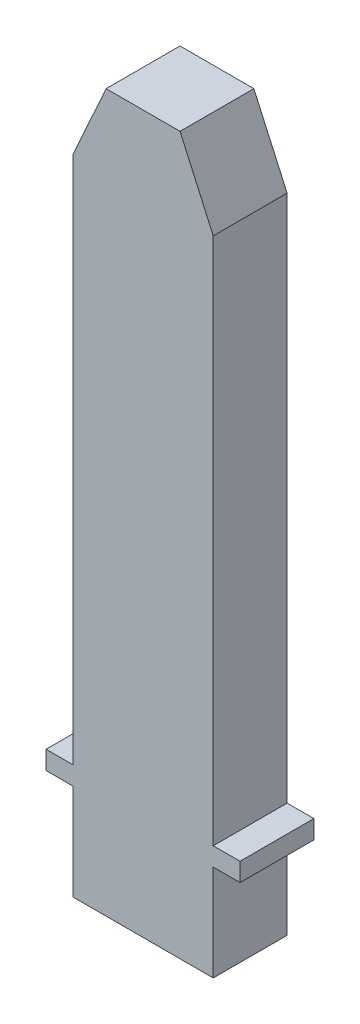
ISO-10303-21;
HEADER;
FILE_DESCRIPTION(('STEP AP214'),'2;1');
FILE_NAME('part.step','',(''),(''),'','','');
FILE_SCHEMA(('AUTOMOTIVE_DESIGN { 1 0 10303 214 1 1 1 1 }'));
ENDSEC;
DATA;
#1=APPLICATION_CONTEXT('core data for automotive mechanical design processes');
#2=APPLICATION_PROTOCOL_DEFINITION('international standard','automotive_design',2000,#1);
#3=PRODUCT_CONTEXT('',#1,'mechanical');
#4=PRODUCT('Part','Part','',(#3));
#5=PRODUCT_RELATED_PRODUCT_CATEGORY('part','',(#4));
#6=PRODUCT_DEFINITION_FORMATION('','',#4);
#7=PRODUCT_DEFINITION_CONTEXT('part definition',#1,'design');
#8=PRODUCT_DEFINITION('design','',#6,#7);
#9=PRODUCT_DEFINITION_SHAPE('','',#8);
#10=(LENGTH_UNIT() NAMED_UNIT(*) SI_UNIT(.MILLI.,.METRE.));
#11=(NAMED_UNIT(*) PLANE_ANGLE_UNIT() SI_UNIT($,.RADIAN.));
#12=(NAMED_UNIT(*) SI_UNIT($,.STERADIAN.) SOLID_ANGLE_UNIT());
#13=UNCERTAINTY_MEASURE_WITH_UNIT(LENGTH_MEASURE(1.E-05),#10,'distance_accuracy_value','');
#14=(GEOMETRIC_REPRESENTATION_CONTEXT(3) GLOBAL_UNCERTAINTY_ASSIGNED_CONTEXT((#13)) GLOBAL_UNIT_ASSIGNED_CONTEXT((#10,
#11,#12)) REPRESENTATION_CONTEXT('',''));
#15=CARTESIAN_POINT('',(0.,0.,0.));
#16=DIRECTION('',(0.,0.,1.));
#17=DIRECTION('',(1.,0.,0.));
#18=AXIS2_PLACEMENT_3D('',#15,#16,#17);
#19=CARTESIAN_POINT('',(-1.9,14.3,2.));
#20=DIRECTION('',(0.911921505175107,-0.410364677328798,0.));
#21=DIRECTION('',(0.410364677328798,0.911921505175107,0.));
#22=AXIS2_PLACEMENT_3D('',#19,#20,#21);
#23=PLANE('',#22);
#24=DIRECTION('',(-0.410364677328797,-0.911921505175106,0.));
#25=VECTOR('',#24,1.);
#26=CARTESIAN_POINT('',(-1.9,14.3,0.));
#27=LINE('',#26,#25);
#28=CARTESIAN_POINT('',(-1.,16.3,0.));
#29=VERTEX_POINT('',#28);
#30=CARTESIAN_POINT('',(-1.9,14.3,0.));
#31=VERTEX_POINT('',#30);
#32=EDGE_CURVE('E164',#29,#31,#27,.T.);
#33=ORIENTED_EDGE('',*,*,#32,.T.);
#34=DIRECTION('',(0.,0.,-1.));
#35=VECTOR('',#34,1.);
#36=CARTESIAN_POINT('',(-1.9,14.3,2.));
#37=LINE('',#36,#35);
#38=CARTESIAN_POINT('',(-1.9,14.3,2.));
#39=VERTEX_POINT('',#38);
#40=EDGE_CURVE('E11',#39,#31,#37,.T.);
#41=ORIENTED_EDGE('',*,*,#40,.F.);
#42=DIRECTION('',(-0.410364677328797,-0.911921505175106,0.));
#43=VECTOR('',#42,1.);
#44=CARTESIAN_POINT('',(-1.9,14.3,2.));
#45=LINE('',#44,#43);
#46=CARTESIAN_POINT('',(-1.,16.3,2.));
#47=VERTEX_POINT('',#46);
#48=EDGE_CURVE('E190',#47,#39,#45,.T.);
#49=ORIENTED_EDGE('',*,*,#48,.F.);
#50=DIRECTION('',(0.,0.,-1.));
#51=VECTOR('',#50,1.);
#52=CARTESIAN_POINT('',(-1.,16.3,2.));
#53=LINE('',#52,#51);
#54=EDGE_CURVE('E160',#47,#29,#53,.T.);
#55=ORIENTED_EDGE('',*,*,#54,.T.);
#56=EDGE_LOOP('',(#33,#41,#49,#55));
#57=FACE_BOUND('',#56,.T.);
#58=ADVANCED_FACE('F32',(#57),#23,.F.);
#59=CARTESIAN_POINT('',(-1.9,14.3,2.));
#60=DIRECTION('',(1.,0.,0.));
#61=DIRECTION('',(0.,1.,0.));
#62=AXIS2_PLACEMENT_3D('',#59,#60,#61);
#63=PLANE('',#62);
#64=DIRECTION('',(0.,-1.,0.));
#65=VECTOR('',#64,1.);
#66=CARTESIAN_POINT('',(-1.9,14.3,0.));
#67=LINE('',#66,#65);
#68=CARTESIAN_POINT('',(-1.9,0.,0.));
#69=VERTEX_POINT('',#68);
#70=EDGE_CURVE('E167',#31,#69,#67,.T.);
#71=ORIENTED_EDGE('',*,*,#70,.T.);
#72=DIRECTION('',(0.,0.,-1.));
#73=VECTOR('',#72,1.);
#74=CARTESIAN_POINT('',(-1.9,0.,2.));
#75=LINE('',#74,#73);
#76=CARTESIAN_POINT('',(-1.9,0.,2.));
#77=VERTEX_POINT('',#76);
#78=EDGE_CURVE('E40',#77,#69,#75,.T.);
#79=ORIENTED_EDGE('',*,*,#78,.F.);
#80=DIRECTION('',(0.,-1.,0.));
#81=VECTOR('',#80,1.);
#82=CARTESIAN_POINT('',(-1.9,14.3,2.));
#83=LINE('',#82,#81);
#84=EDGE_CURVE('E109',#39,#77,#83,.T.);
#85=ORIENTED_EDGE('',*,*,#84,.F.);
#86=ORIENTED_EDGE('',*,*,#40,.T.);
#87=EDGE_LOOP('',(#71,#79,#85,#86));
#88=FACE_BOUND('',#87,.T.);
#89=ADVANCED_FACE('F278',(#88),#63,.F.);
#90=CARTESIAN_POINT('',(-2.625,0.,2.));
#91=DIRECTION('',(0.,-1.,0.));
#92=DIRECTION('',(1.,0.,0.));
#93=AXIS2_PLACEMENT_3D('',#90,#91,#92);
#94=PLANE('',#93);
#95=DIRECTION('',(-1.,0.,0.));
#96=VECTOR('',#95,1.);
#97=CARTESIAN_POINT('',(-2.625,0.,0.));
#98=LINE('',#97,#96);
#99=CARTESIAN_POINT('',(-2.625,0.,0.));
#100=VERTEX_POINT('',#99);
#101=EDGE_CURVE('E169',#69,#100,#98,.T.);
#102=ORIENTED_EDGE('',*,*,#101,.T.);
#103=DIRECTION('',(0.,0.,-1.));
#104=VECTOR('',#103,1.);
#105=CARTESIAN_POINT('',(-2.625,0.,2.));
#106=LINE('',#105,#104);
#107=CARTESIAN_POINT('',(-2.625,0.,2.));
#108=VERTEX_POINT('',#107);
#109=EDGE_CURVE('E215',#108,#100,#106,.T.);
#110=ORIENTED_EDGE('',*,*,#109,.F.);
#111=DIRECTION('',(-1.,0.,0.));
#112=VECTOR('',#111,1.);
#113=CARTESIAN_POINT('',(-2.625,0.,2.));
#114=LINE('',#113,#112);
#115=EDGE_CURVE('E223',#77,#108,#114,.T.);
#116=ORIENTED_EDGE('',*,*,#115,.F.);
#117=ORIENTED_EDGE('',*,*,#78,.T.);
#118=EDGE_LOOP('',(#102,#110,#116,#117));
#119=FACE_BOUND('',#118,.T.);
#120=ADVANCED_FACE('F221',(#119),#94,.F.);
#121=CARTESIAN_POINT('',(-2.625,0.,2.));
#122=DIRECTION('',(1.,0.,0.));
#123=DIRECTION('',(0.,0.,-1.));
#124=AXIS2_PLACEMENT_3D('',#121,#122,#123);
#125=PLANE('',#124);
#126=DIRECTION('',(0.,-1.,0.));
#127=VECTOR('',#126,1.);
#128=CARTESIAN_POINT('',(-2.625,0.,0.));
#129=LINE('',#128,#127);
#130=CARTESIAN_POINT('',(-2.625,-0.5,0.));
#131=VERTEX_POINT('',#130);
#132=EDGE_CURVE('E171',#100,#131,#129,.T.);
#133=ORIENTED_EDGE('',*,*,#132,.T.);
#134=DIRECTION('',(0.,0.,-1.));
#135=VECTOR('',#134,1.);
#136=CARTESIAN_POINT('',(-2.625,-0.5,2.));
#137=LINE('',#136,#135);
#138=CARTESIAN_POINT('',(-2.625,-0.5,2.));
#139=VERTEX_POINT('',#138);
#140=EDGE_CURVE('E212',#139,#131,#137,.T.);
#141=ORIENTED_EDGE('',*,*,#140,.F.);
#142=DIRECTION('',(0.,-1.,0.));
#143=VECTOR('',#142,1.);
#144=CARTESIAN_POINT('',(-2.625,0.,2.));
#145=LINE('',#144,#143);
#146=EDGE_CURVE('E241',#108,#139,#145,.T.);
#147=ORIENTED_EDGE('',*,*,#146,.F.);
#148=ORIENTED_EDGE('',*,*,#109,.T.);
#149=EDGE_LOOP('',(#133,#141,#147,#148));
#150=FACE_BOUND('',#149,.T.);
#151=ADVANCED_FACE('F232',(#150),#125,.F.);
#152=CARTESIAN_POINT('',(-2.625,-0.5,2.));
#153=DIRECTION('',(0.,1.,0.));
#154=DIRECTION('',(0.,0.,1.));
#155=AXIS2_PLACEMENT_3D('',#152,#153,#154);
#156=PLANE('',#155);
#157=DIRECTION('',(1.,0.,0.));
#158=VECTOR('',#157,1.);
#159=CARTESIAN_POINT('',(-2.625,-0.5,0.));
#160=LINE('',#159,#158);
#161=CARTESIAN_POINT('',(-1.9,-0.5,0.));
#162=VERTEX_POINT('',#161);
#163=EDGE_CURVE('E173',#131,#162,#160,.T.);
#164=ORIENTED_EDGE('',*,*,#163,.T.);
#165=DIRECTION('',(0.,0.,-1.));
#166=VECTOR('',#165,1.);
#167=CARTESIAN_POINT('',(-1.9,-0.5,2.));
#168=LINE('',#167,#166);
#169=CARTESIAN_POINT('',(-1.9,-0.5,2.));
#170=VERTEX_POINT('',#169);
#171=EDGE_CURVE('E209',#170,#162,#168,.T.);
#172=ORIENTED_EDGE('',*,*,#171,.F.);
#173=DIRECTION('',(1.,0.,0.));
#174=VECTOR('',#173,1.);
#175=CARTESIAN_POINT('',(-2.625,-0.5,2.));
#176=LINE('',#175,#174);
#177=EDGE_CURVE('E238',#139,#170,#176,.T.);
#178=ORIENTED_EDGE('',*,*,#177,.F.);
#179=ORIENTED_EDGE('',*,*,#140,.T.);
#180=EDGE_LOOP('',(#164,#172,#178,#179));
#181=FACE_BOUND('',#180,.T.);
#182=ADVANCED_FACE('F236',(#181),#156,.F.);
#183=CARTESIAN_POINT('',(-1.9,-0.5,2.));
#184=DIRECTION('',(1.,0.,0.));
#185=DIRECTION('',(0.,1.,0.));
#186=AXIS2_PLACEMENT_3D('',#183,#184,#185);
#187=PLANE('',#186);
#188=DIRECTION('',(0.,-1.,0.));
#189=VECTOR('',#188,1.);
#190=CARTESIAN_POINT('',(-1.9,-0.5,0.));
#191=LINE('',#190,#189);
#192=CARTESIAN_POINT('',(-1.9,-3.1,0.));
#193=VERTEX_POINT('',#192);
#194=EDGE_CURVE('E175',#162,#193,#191,.T.);
#195=ORIENTED_EDGE('',*,*,#194,.T.);
#196=DIRECTION('',(0.,0.,-1.));
#197=VECTOR('',#196,1.);
#198=CARTESIAN_POINT('',(-1.9,-3.1,2.));
#199=LINE('',#198,#197);
#200=CARTESIAN_POINT('',(-1.9,-3.1,2.));
#201=VERTEX_POINT('',#200);
#202=EDGE_CURVE('E206',#201,#193,#199,.T.);
#203=ORIENTED_EDGE('',*,*,#202,.F.);
#204=DIRECTION('',(0.,-1.,0.));
#205=VECTOR('',#204,1.);
#206=CARTESIAN_POINT('',(-1.9,-0.5,2.));
#207=LINE('',#206,#205);
#208=EDGE_CURVE('E240',#170,#201,#207,.T.);
#209=ORIENTED_EDGE('',*,*,#208,.F.);
#210=ORIENTED_EDGE('',*,*,#171,.T.);
#211=EDGE_LOOP('',(#195,#203,#209,#210));
#212=FACE_BOUND('',#211,.T.);
#213=ADVANCED_FACE('F291',(#212),#187,.F.);
#214=CARTESIAN_POINT('',(-1.9,-3.1,2.));
#215=DIRECTION('',(0.,1.,0.));
#216=DIRECTION('',(0.,0.,1.));
#217=AXIS2_PLACEMENT_3D('',#214,#215,#216);
#218=PLANE('',#217);
#219=DIRECTION('',(1.,0.,0.));
#220=VECTOR('',#219,1.);
#221=CARTESIAN_POINT('',(-1.9,-3.1,0.));
#222=LINE('',#221,#220);
#223=CARTESIAN_POINT('',(1.9,-3.1,0.));
#224=VERTEX_POINT('',#223);
#225=EDGE_CURVE('E177',#193,#224,#222,.T.);
#226=ORIENTED_EDGE('',*,*,#225,.T.);
#227=DIRECTION('',(0.,0.,-1.));
#228=VECTOR('',#227,1.);
#229=CARTESIAN_POINT('',(1.9,-3.1,2.));
#230=LINE('',#229,#228);
#231=CARTESIAN_POINT('',(1.9,-3.1,2.));
#232=VERTEX_POINT('',#231);
#233=EDGE_CURVE('E203',#232,#224,#230,.T.);
#234=ORIENTED_EDGE('',*,*,#233,.F.);
#235=DIRECTION('',(1.,0.,0.));
#236=VECTOR('',#235,1.);
#237=CARTESIAN_POINT('',(-1.9,-3.1,2.));
#238=LINE('',#237,#236);
#239=EDGE_CURVE('E243',#201,#232,#238,.T.);
#240=ORIENTED_EDGE('',*,*,#239,.F.);
#241=ORIENTED_EDGE('',*,*,#202,.T.);
#242=EDGE_LOOP('',(#226,#234,#240,#241));
#243=FACE_BOUND('',#242,.T.);
#244=ADVANCED_FACE('F294',(#243),#218,.F.);
#245=CARTESIAN_POINT('',(1.9,-0.5,2.));
#246=DIRECTION('',(-1.,0.,0.));
#247=DIRECTION('',(0.,-1.,0.));
#248=AXIS2_PLACEMENT_3D('',#245,#246,#247);
#249=PLANE('',#248);
#250=DIRECTION('',(0.,1.,0.));
#251=VECTOR('',#250,1.);
#252=CARTESIAN_POINT('',(1.9,-0.5,0.));
#253=LINE('',#252,#251);
#254=CARTESIAN_POINT('',(1.9,-0.5,0.));
#255=VERTEX_POINT('',#254);
#256=EDGE_CURVE('E179',#224,#255,#253,.T.);
#257=ORIENTED_EDGE('',*,*,#256,.T.);
#258=DIRECTION('',(0.,0.,-1.));
#259=VECTOR('',#258,1.);
#260=CARTESIAN_POINT('',(1.9,-0.5,2.));
#261=LINE('',#260,#259);
#262=CARTESIAN_POINT('',(1.9,-0.5,2.));
#263=VERTEX_POINT('',#262);
#264=EDGE_CURVE('E200',#263,#255,#261,.T.);
#265=ORIENTED_EDGE('',*,*,#264,.F.);
#266=DIRECTION('',(0.,1.,0.));
#267=VECTOR('',#266,1.);
#268=CARTESIAN_POINT('',(1.9,-0.5,2.));
#269=LINE('',#268,#267);
#270=EDGE_CURVE('E249',#232,#263,#269,.T.);
#271=ORIENTED_EDGE('',*,*,#270,.F.);
#272=ORIENTED_EDGE('',*,*,#233,.T.);
#273=EDGE_LOOP('',(#257,#265,#271,#272));
#274=FACE_BOUND('',#273,.T.);
#275=ADVANCED_FACE('F298',(#274),#249,.F.);
#276=CARTESIAN_POINT('',(1.9,-0.5,2.));
#277=DIRECTION('',(0.,1.,0.));
#278=DIRECTION('',(0.,0.,1.));
#279=AXIS2_PLACEMENT_3D('',#276,#277,#278);
#280=PLANE('',#279);
#281=DIRECTION('',(1.,0.,0.));
#282=VECTOR('',#281,1.);
#283=CARTESIAN_POINT('',(1.9,-0.5,0.));
#284=LINE('',#283,#282);
#285=CARTESIAN_POINT('',(2.625,-0.5,0.));
#286=VERTEX_POINT('',#285);
#287=EDGE_CURVE('E181',#255,#286,#284,.T.);
#288=ORIENTED_EDGE('',*,*,#287,.T.);
#289=DIRECTION('',(0.,0.,-1.));
#290=VECTOR('',#289,1.);
#291=CARTESIAN_POINT('',(2.625,-0.5,2.));
#292=LINE('',#291,#290);
#293=CARTESIAN_POINT('',(2.625,-0.5,2.));
#294=VERTEX_POINT('',#293);
#295=EDGE_CURVE('E197',#294,#286,#292,.T.);
#296=ORIENTED_EDGE('',*,*,#295,.F.);
#297=DIRECTION('',(1.,0.,0.));
#298=VECTOR('',#297,1.);
#299=CARTESIAN_POINT('',(1.9,-0.5,2.));
#300=LINE('',#299,#298);
#301=EDGE_CURVE('E251',#263,#294,#300,.T.);
#302=ORIENTED_EDGE('',*,*,#301,.F.);
#303=ORIENTED_EDGE('',*,*,#264,.T.);
#304=EDGE_LOOP('',(#288,#296,#302,#303));
#305=FACE_BOUND('',#304,.T.);
#306=ADVANCED_FACE('F302',(#305),#280,.F.);
#307=CARTESIAN_POINT('',(2.625,0.,2.));
#308=DIRECTION('',(-1.,0.,0.));
#309=DIRECTION('',(0.,0.,1.));
#310=AXIS2_PLACEMENT_3D('',#307,#308,#309);
#311=PLANE('',#310);
#312=DIRECTION('',(0.,1.,0.));
#313=VECTOR('',#312,1.);
#314=CARTESIAN_POINT('',(2.625,0.,0.));
#315=LINE('',#314,#313);
#316=CARTESIAN_POINT('',(2.625,0.,0.));
#317=VERTEX_POINT('',#316);
#318=EDGE_CURVE('E183',#286,#317,#315,.T.);
#319=ORIENTED_EDGE('',*,*,#318,.T.);
#320=DIRECTION('',(0.,0.,-1.));
#321=VECTOR('',#320,1.);
#322=CARTESIAN_POINT('',(2.625,0.,2.));
#323=LINE('',#322,#321);
#324=CARTESIAN_POINT('',(2.625,0.,2.));
#325=VERTEX_POINT('',#324);
#326=EDGE_CURVE('E194',#325,#317,#323,.T.);
#327=ORIENTED_EDGE('',*,*,#326,.F.);
#328=DIRECTION('',(0.,1.,0.));
#329=VECTOR('',#328,1.);
#330=CARTESIAN_POINT('',(2.625,0.,2.));
#331=LINE('',#330,#329);
#332=EDGE_CURVE('E253',#294,#325,#331,.T.);
#333=ORIENTED_EDGE('',*,*,#332,.F.);
#334=ORIENTED_EDGE('',*,*,#295,.T.);
#335=EDGE_LOOP('',(#319,#327,#333,#334));
#336=FACE_BOUND('',#335,.T.);
#337=ADVANCED_FACE('F259',(#336),#311,.F.);
#338=CARTESIAN_POINT('',(1.9,0.,2.));
#339=DIRECTION('',(0.,-1.,0.));
#340=DIRECTION('',(1.,0.,0.));
#341=AXIS2_PLACEMENT_3D('',#338,#339,#340);
#342=PLANE('',#341);
#343=DIRECTION('',(-1.,0.,0.));
#344=VECTOR('',#343,1.);
#345=CARTESIAN_POINT('',(1.9,0.,0.));
#346=LINE('',#345,#344);
#347=CARTESIAN_POINT('',(1.9,0.,0.));
#348=VERTEX_POINT('',#347);
#349=EDGE_CURVE('E185',#317,#348,#346,.T.);
#350=ORIENTED_EDGE('',*,*,#349,.T.);
#351=DIRECTION('',(0.,0.,-1.));
#352=VECTOR('',#351,1.);
#353=CARTESIAN_POINT('',(1.9,0.,2.));
#354=LINE('',#353,#352);
#355=CARTESIAN_POINT('',(1.9,0.,2.));
#356=VERTEX_POINT('',#355);
#357=EDGE_CURVE('E155',#356,#348,#354,.T.);
#358=ORIENTED_EDGE('',*,*,#357,.F.);
#359=DIRECTION('',(-1.,0.,0.));
#360=VECTOR('',#359,1.);
#361=CARTESIAN_POINT('',(1.9,0.,2.));
#362=LINE('',#361,#360);
#363=EDGE_CURVE('E146',#325,#356,#362,.T.);
#364=ORIENTED_EDGE('',*,*,#363,.F.);
#365=ORIENTED_EDGE('',*,*,#326,.T.);
#366=EDGE_LOOP('',(#350,#358,#364,#365));
#367=FACE_BOUND('',#366,.T.);
#368=ADVANCED_FACE('F263',(#367),#342,.F.);
#369=CARTESIAN_POINT('',(1.9,14.3,2.));
#370=DIRECTION('',(-1.,0.,0.));
#371=DIRECTION('',(0.,-1.,0.));
#372=AXIS2_PLACEMENT_3D('',#369,#370,#371);
#373=PLANE('',#372);
#374=DIRECTION('',(0.,1.,0.));
#375=VECTOR('',#374,1.);
#376=CARTESIAN_POINT('',(1.9,14.3,0.));
#377=LINE('',#376,#375);
#378=CARTESIAN_POINT('',(1.9,14.3,0.));
#379=VERTEX_POINT('',#378);
#380=EDGE_CURVE('E154',#348,#379,#377,.T.);
#381=ORIENTED_EDGE('',*,*,#380,.T.);
#382=DIRECTION('',(0.,0.,-1.));
#383=VECTOR('',#382,1.);
#384=CARTESIAN_POINT('',(1.9,14.3,2.));
#385=LINE('',#384,#383);
#386=CARTESIAN_POINT('',(1.9,14.3,2.));
#387=VERTEX_POINT('',#386);
#388=EDGE_CURVE('E151',#387,#379,#385,.T.);
#389=ORIENTED_EDGE('',*,*,#388,.F.);
#390=DIRECTION('',(0.,1.,0.));
#391=VECTOR('',#390,1.);
#392=CARTESIAN_POINT('',(1.9,14.3,2.));
#393=LINE('',#392,#391);
#394=EDGE_CURVE('E140',#356,#387,#393,.T.);
#395=ORIENTED_EDGE('',*,*,#394,.F.);
#396=ORIENTED_EDGE('',*,*,#357,.T.);
#397=EDGE_LOOP('',(#381,#389,#395,#396));
#398=FACE_BOUND('',#397,.T.);
#399=ADVANCED_FACE('F152',(#398),#373,.F.);
#400=CARTESIAN_POINT('',(0.999999999999998,16.3,2.));
#401=DIRECTION('',(-0.911921505175107,-0.410364677328798,0.));
#402=DIRECTION('',(0.410364677328798,-0.911921505175107,0.));
#403=AXIS2_PLACEMENT_3D('',#400,#401,#402);
#404=PLANE('',#403);
#405=DIRECTION('',(-0.410364677328797,0.911921505175106,0.));
#406=VECTOR('',#405,1.);
#407=CARTESIAN_POINT('',(0.999999999999998,16.3,0.));
#408=LINE('',#407,#406);
#409=CARTESIAN_POINT('',(0.999999999999998,16.3,0.));
#410=VERTEX_POINT('',#409);
#411=EDGE_CURVE('E95',#379,#410,#408,.T.);
#412=ORIENTED_EDGE('',*,*,#411,.T.);
#413=DIRECTION('',(0.,0.,-1.));
#414=VECTOR('',#413,1.);
#415=CARTESIAN_POINT('',(0.999999999999998,16.3,2.));
#416=LINE('',#415,#414);
#417=CARTESIAN_POINT('',(0.999999999999998,16.3,2.));
#418=VERTEX_POINT('',#417);
#419=EDGE_CURVE('E156',#418,#410,#416,.T.);
#420=ORIENTED_EDGE('',*,*,#419,.F.);
#421=DIRECTION('',(-0.410364677328797,0.911921505175106,0.));
#422=VECTOR('',#421,1.);
#423=CARTESIAN_POINT('',(0.999999999999998,16.3,2.));
#424=LINE('',#423,#422);
#425=EDGE_CURVE('E144',#387,#418,#424,.T.);
#426=ORIENTED_EDGE('',*,*,#425,.F.);
#427=ORIENTED_EDGE('',*,*,#388,.T.);
#428=EDGE_LOOP('',(#412,#420,#426,#427));
#429=FACE_BOUND('',#428,.T.);
#430=ADVANCED_FACE('F158',(#429),#404,.F.);
#431=CARTESIAN_POINT('',(-1.,16.3,2.));
#432=DIRECTION('',(0.,-1.,0.));
#433=DIRECTION('',(0.,0.,-1.));
#434=AXIS2_PLACEMENT_3D('',#431,#432,#433);
#435=PLANE('',#434);
#436=DIRECTION('',(-1.,0.,0.));
#437=VECTOR('',#436,1.);
#438=CARTESIAN_POINT('',(-1.,16.3,0.));
#439=LINE('',#438,#437);
#440=EDGE_CURVE('E101',#410,#29,#439,.T.);
#441=ORIENTED_EDGE('',*,*,#440,.T.);
#442=ORIENTED_EDGE('',*,*,#54,.F.);
#443=DIRECTION('',(-1.,0.,0.));
#444=VECTOR('',#443,1.);
#445=CARTESIAN_POINT('',(-1.,16.3,2.));
#446=LINE('',#445,#444);
#447=EDGE_CURVE('E48',#418,#47,#446,.T.);
#448=ORIENTED_EDGE('',*,*,#447,.F.);
#449=ORIENTED_EDGE('',*,*,#419,.T.);
#450=EDGE_LOOP('',(#441,#442,#448,#449));
#451=FACE_BOUND('',#450,.T.);
#452=ADVANCED_FACE('F267',(#451),#435,.F.);
#453=CARTESIAN_POINT('',(0.,0.,2.));
#454=DIRECTION('',(0.,0.,-1.));
#455=DIRECTION('',(-1.,0.,0.));
#456=AXIS2_PLACEMENT_3D('',#453,#454,#455);
#457=PLANE('',#456);
#458=ORIENTED_EDGE('',*,*,#48,.T.);
#459=ORIENTED_EDGE('',*,*,#84,.T.);
#460=ORIENTED_EDGE('',*,*,#115,.T.);
#461=ORIENTED_EDGE('',*,*,#146,.T.);
#462=ORIENTED_EDGE('',*,*,#177,.T.);
#463=ORIENTED_EDGE('',*,*,#208,.T.);
#464=ORIENTED_EDGE('',*,*,#239,.T.);
#465=ORIENTED_EDGE('',*,*,#270,.T.);
#466=ORIENTED_EDGE('',*,*,#301,.T.);
#467=ORIENTED_EDGE('',*,*,#332,.T.);
#468=ORIENTED_EDGE('',*,*,#363,.T.);
#469=ORIENTED_EDGE('',*,*,#394,.T.);
#470=ORIENTED_EDGE('',*,*,#425,.T.);
#471=ORIENTED_EDGE('',*,*,#447,.T.);
#472=EDGE_LOOP('',(#458,#459,#460,#461,#462,#463,#464,#465,#466,#467,#468,#469,#470,#471));
#473=FACE_BOUND('',#472,.T.);
#474=ADVANCED_FACE('F142',(#473),#457,.F.);
#475=CARTESIAN_POINT('',(0.,0.,0.));
#476=DIRECTION('',(0.,0.,-1.));
#477=DIRECTION('',(-1.,0.,0.));
#478=AXIS2_PLACEMENT_3D('',#475,#476,#477);
#479=PLANE('',#478);
#480=ORIENTED_EDGE('',*,*,#32,.F.);
#481=ORIENTED_EDGE('',*,*,#440,.F.);
#482=ORIENTED_EDGE('',*,*,#411,.F.);
#483=ORIENTED_EDGE('',*,*,#380,.F.);
#484=ORIENTED_EDGE('',*,*,#349,.F.);
#485=ORIENTED_EDGE('',*,*,#318,.F.);
#486=ORIENTED_EDGE('',*,*,#287,.F.);
#487=ORIENTED_EDGE('',*,*,#256,.F.);
#488=ORIENTED_EDGE('',*,*,#225,.F.);
#489=ORIENTED_EDGE('',*,*,#194,.F.);
#490=ORIENTED_EDGE('',*,*,#163,.F.);
#491=ORIENTED_EDGE('',*,*,#132,.F.);
#492=ORIENTED_EDGE('',*,*,#101,.F.);
#493=ORIENTED_EDGE('',*,*,#70,.F.);
#494=EDGE_LOOP('',(#480,#481,#482,#483,#484,#485,#486,#487,#488,#489,#490,#491,#492,#493));
#495=FACE_BOUND('',#494,.T.);
#496=ADVANCED_FACE('F227',(#495),#479,.T.);
#497=CLOSED_SHELL('',(#58,#89,#120,#151,#182,#213,#244,#275,#306,#337,#368,#399,#430,#452,#474,#496));
#498=MANIFOLD_SOLID_BREP('B2',#497);
#499=ADVANCED_BREP_SHAPE_REPRESENTATION('',(#18,#498),#14);
#500=SHAPE_DEFINITION_REPRESENTATION(#9,#499);
ENDSEC;
END-ISO-10303-21;
